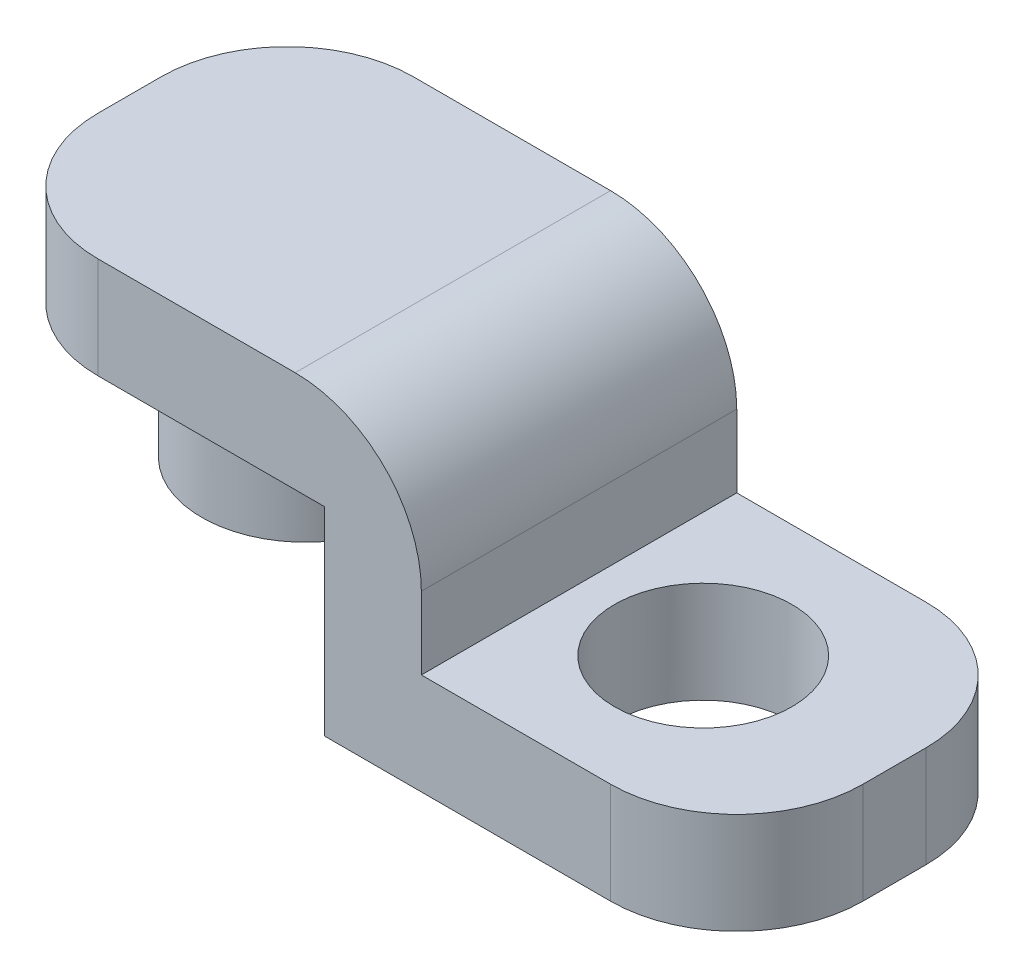
ISO-10303-21;
HEADER;
FILE_DESCRIPTION(('STEP AP214'),'2;1');
FILE_NAME('part.step','',(''),(''),'','','');
FILE_SCHEMA(('AUTOMOTIVE_DESIGN { 1 0 10303 214 1 1 1 1 }'));
ENDSEC;
DATA;
#1=APPLICATION_CONTEXT('core data for automotive mechanical design processes');
#2=APPLICATION_PROTOCOL_DEFINITION('international standard','automotive_design',2000,#1);
#3=PRODUCT_CONTEXT('',#1,'mechanical');
#4=PRODUCT('Part','Part','',(#3));
#5=PRODUCT_RELATED_PRODUCT_CATEGORY('part','',(#4));
#6=PRODUCT_DEFINITION_FORMATION('','',#4);
#7=PRODUCT_DEFINITION_CONTEXT('part definition',#1,'design');
#8=PRODUCT_DEFINITION('design','',#6,#7);
#9=PRODUCT_DEFINITION_SHAPE('','',#8);
#10=(LENGTH_UNIT() NAMED_UNIT(*) SI_UNIT(.MILLI.,.METRE.));
#11=(NAMED_UNIT(*) PLANE_ANGLE_UNIT() SI_UNIT($,.RADIAN.));
#12=(NAMED_UNIT(*) SI_UNIT($,.STERADIAN.) SOLID_ANGLE_UNIT());
#13=UNCERTAINTY_MEASURE_WITH_UNIT(LENGTH_MEASURE(1.E-05),#10,'distance_accuracy_value','');
#14=(GEOMETRIC_REPRESENTATION_CONTEXT(3) GLOBAL_UNCERTAINTY_ASSIGNED_CONTEXT((#13)) GLOBAL_UNIT_ASSIGNED_CONTEXT((#10,
#11,#12)) REPRESENTATION_CONTEXT('',''));
#15=CARTESIAN_POINT('',(0.,0.,0.));
#16=DIRECTION('',(0.,0.,1.));
#17=DIRECTION('',(1.,0.,0.));
#18=AXIS2_PLACEMENT_3D('',#15,#16,#17);
#19=CARTESIAN_POINT('',(3.55,4.,6.35));
#20=DIRECTION('',(0.,1.,0.));
#21=DIRECTION('',(-1.,0.,0.));
#22=AXIS2_PLACEMENT_3D('',#19,#20,#21);
#23=PLANE('',#22);
#24=CARTESIAN_POINT('',(0.,4.,3.175));
#25=DIRECTION('',(0.,1.,0.));
#26=DIRECTION('',(-1.,0.,0.));
#27=AXIS2_PLACEMENT_3D('',#24,#25,#26);
#28=CIRCLE('',#27,2.1);
#29=CARTESIAN_POINT('',(-2.1,4.,3.175));
#30=VERTEX_POINT('',#29);
#31=EDGE_CURVE('E255',#30,#30,#28,.F.);
#32=ORIENTED_EDGE('',*,*,#31,.F.);
#33=EDGE_LOOP('',(#32));
#34=FACE_BOUND('',#33,.T.);
#35=DIRECTION('',(1.,0.,0.));
#36=VECTOR('',#35,1.);
#37=CARTESIAN_POINT('',(3.55,4.,6.35));
#38=LINE('',#37,#36);
#39=CARTESIAN_POINT('',(-1.01,4.,6.35));
#40=VERTEX_POINT('',#39);
#41=CARTESIAN_POINT('',(3.55,4.,6.35));
#42=VERTEX_POINT('',#41);
#43=EDGE_CURVE('E139',#40,#42,#38,.T.);
#44=ORIENTED_EDGE('',*,*,#43,.F.);
#45=CARTESIAN_POINT('',(-1.01,4.,3.81));
#46=DIRECTION('',(0.,1.,0.));
#47=DIRECTION('',(-1.,0.,0.));
#48=AXIS2_PLACEMENT_3D('',#45,#46,#47);
#49=CIRCLE('',#48,2.54);
#50=CARTESIAN_POINT('',(-3.55,4.,3.81));
#51=VERTEX_POINT('',#50);
#52=EDGE_CURVE('E264',#40,#51,#49,.F.);
#53=ORIENTED_EDGE('',*,*,#52,.T.);
#54=DIRECTION('',(0.,0.,-1.));
#55=VECTOR('',#54,1.);
#56=CARTESIAN_POINT('',(-3.55,4.,0.));
#57=LINE('',#56,#55);
#58=CARTESIAN_POINT('',(-3.55,4.,2.54));
#59=VERTEX_POINT('',#58);
#60=EDGE_CURVE('E284',#51,#59,#57,.T.);
#61=ORIENTED_EDGE('',*,*,#60,.T.);
#62=CARTESIAN_POINT('',(-1.01,4.,2.54));
#63=DIRECTION('',(0.,1.,0.));
#64=DIRECTION('',(-1.,0.,0.));
#65=AXIS2_PLACEMENT_3D('',#62,#63,#64);
#66=CIRCLE('',#65,2.54);
#67=CARTESIAN_POINT('',(-1.01,4.,0.));
#68=VERTEX_POINT('',#67);
#69=EDGE_CURVE('E261',#59,#68,#66,.F.);
#70=ORIENTED_EDGE('',*,*,#69,.T.);
#71=DIRECTION('',(1.,0.,0.));
#72=VECTOR('',#71,1.);
#73=CARTESIAN_POINT('',(3.55,4.,0.));
#74=LINE('',#73,#72);
#75=CARTESIAN_POINT('',(3.55,4.,0.));
#76=VERTEX_POINT('',#75);
#77=EDGE_CURVE('E156',#68,#76,#74,.T.);
#78=ORIENTED_EDGE('',*,*,#77,.T.);
#79=DIRECTION('',(0.,0.,-1.));
#80=VECTOR('',#79,1.);
#81=CARTESIAN_POINT('',(3.55,4.,6.35));
#82=LINE('',#81,#80);
#83=EDGE_CURVE('E154',#42,#76,#82,.T.);
#84=ORIENTED_EDGE('',*,*,#83,.F.);
#85=EDGE_LOOP('',(#44,#53,#61,#70,#78,#84));
#86=FACE_BOUND('',#85,.T.);
#87=ADVANCED_FACE('F41',(#34,#86),#23,.F.);
#88=CARTESIAN_POINT('',(3.55,0.,6.35));
#89=DIRECTION('',(1.,0.,0.));
#90=DIRECTION('',(0.,0.,-1.));
#91=AXIS2_PLACEMENT_3D('',#88,#89,#90);
#92=PLANE('',#91);
#93=DIRECTION('',(0.,-1.,0.));
#94=VECTOR('',#93,1.);
#95=CARTESIAN_POINT('',(3.55,0.,0.));
#96=LINE('',#95,#94);
#97=CARTESIAN_POINT('',(3.55,0.,0.));
#98=VERTEX_POINT('',#97);
#99=EDGE_CURVE('E186',#76,#98,#96,.T.);
#100=ORIENTED_EDGE('',*,*,#99,.T.);
#101=DIRECTION('',(0.,0.,-1.));
#102=VECTOR('',#101,1.);
#103=CARTESIAN_POINT('',(3.55,0.,6.35));
#104=LINE('',#103,#102);
#105=CARTESIAN_POINT('',(3.55,0.,6.35));
#106=VERTEX_POINT('',#105);
#107=EDGE_CURVE('E161',#106,#98,#104,.T.);
#108=ORIENTED_EDGE('',*,*,#107,.F.);
#109=DIRECTION('',(0.,-1.,0.));
#110=VECTOR('',#109,1.);
#111=CARTESIAN_POINT('',(3.55,0.,6.35));
#112=LINE('',#111,#110);
#113=EDGE_CURVE('E145',#42,#106,#112,.T.);
#114=ORIENTED_EDGE('',*,*,#113,.F.);
#115=ORIENTED_EDGE('',*,*,#83,.T.);
#116=EDGE_LOOP('',(#100,#108,#114,#115));
#117=FACE_BOUND('',#116,.T.);
#118=ADVANCED_FACE('F163',(#117),#92,.F.);
#119=CARTESIAN_POINT('',(11.85,0.,6.35));
#120=DIRECTION('',(0.,1.,0.));
#121=DIRECTION('',(-1.,0.,0.));
#122=AXIS2_PLACEMENT_3D('',#119,#120,#121);
#123=PLANE('',#122);
#124=CARTESIAN_POINT('',(8.,0.,3.175));
#125=DIRECTION('',(0.,1.,0.));
#126=DIRECTION('',(-1.,0.,0.));
#127=AXIS2_PLACEMENT_3D('',#124,#125,#126);
#128=CIRCLE('',#127,1.7859375);
#129=CARTESIAN_POINT('',(6.2140625,0.,3.175));
#130=VERTEX_POINT('',#129);
#131=EDGE_CURVE('E187',#130,#130,#128,.F.);
#132=ORIENTED_EDGE('',*,*,#131,.F.);
#133=EDGE_LOOP('',(#132));
#134=FACE_BOUND('',#133,.T.);
#135=DIRECTION('',(1.,0.,0.));
#136=VECTOR('',#135,1.);
#137=CARTESIAN_POINT('',(11.85,0.,0.));
#138=LINE('',#137,#136);
#139=CARTESIAN_POINT('',(9.31,0.,0.));
#140=VERTEX_POINT('',#139);
#141=EDGE_CURVE('E190',#98,#140,#138,.T.);
#142=ORIENTED_EDGE('',*,*,#141,.T.);
#143=CARTESIAN_POINT('',(9.31,0.,2.54));
#144=DIRECTION('',(0.,1.,0.));
#145=DIRECTION('',(-1.,0.,0.));
#146=AXIS2_PLACEMENT_3D('',#143,#144,#145);
#147=CIRCLE('',#146,2.54);
#148=CARTESIAN_POINT('',(11.85,0.,2.54));
#149=VERTEX_POINT('',#148);
#150=EDGE_CURVE('E238',#140,#149,#147,.F.);
#151=ORIENTED_EDGE('',*,*,#150,.T.);
#152=DIRECTION('',(0.,0.,-1.));
#153=VECTOR('',#152,1.);
#154=CARTESIAN_POINT('',(11.85,0.,6.35));
#155=LINE('',#154,#153);
#156=CARTESIAN_POINT('',(11.85,0.,3.81));
#157=VERTEX_POINT('',#156);
#158=EDGE_CURVE('E211',#157,#149,#155,.T.);
#159=ORIENTED_EDGE('',*,*,#158,.F.);
#160=CARTESIAN_POINT('',(9.31,0.,3.81));
#161=DIRECTION('',(0.,1.,0.));
#162=DIRECTION('',(-1.,0.,0.));
#163=AXIS2_PLACEMENT_3D('',#160,#161,#162);
#164=CIRCLE('',#163,2.54);
#165=CARTESIAN_POINT('',(9.31,0.,6.35));
#166=VERTEX_POINT('',#165);
#167=EDGE_CURVE('E235',#157,#166,#164,.F.);
#168=ORIENTED_EDGE('',*,*,#167,.T.);
#169=DIRECTION('',(1.,0.,0.));
#170=VECTOR('',#169,1.);
#171=CARTESIAN_POINT('',(11.85,0.,6.35));
#172=LINE('',#171,#170);
#173=EDGE_CURVE('E167',#106,#166,#172,.T.);
#174=ORIENTED_EDGE('',*,*,#173,.F.);
#175=ORIENTED_EDGE('',*,*,#107,.T.);
#176=EDGE_LOOP('',(#142,#151,#159,#168,#174,#175));
#177=FACE_BOUND('',#176,.T.);
#178=ADVANCED_FACE('F305',(#134,#177),#123,.F.);
#179=CARTESIAN_POINT('',(11.85,2.04,6.35));
#180=DIRECTION('',(-1.,0.,0.));
#181=DIRECTION('',(0.,0.,1.));
#182=AXIS2_PLACEMENT_3D('',#179,#180,#181);
#183=PLANE('',#182);
#184=ORIENTED_EDGE('',*,*,#158,.T.);
#185=DIRECTION('',(0.,1.,0.));
#186=VECTOR('',#185,1.);
#187=CARTESIAN_POINT('',(11.85,2.04,2.54));
#188=LINE('',#187,#186);
#189=CARTESIAN_POINT('',(11.85,2.04,2.54));
#190=VERTEX_POINT('',#189);
#191=EDGE_CURVE('E219',#149,#190,#188,.T.);
#192=ORIENTED_EDGE('',*,*,#191,.T.);
#193=DIRECTION('',(0.,0.,-1.));
#194=VECTOR('',#193,1.);
#195=CARTESIAN_POINT('',(11.85,2.04,6.35));
#196=LINE('',#195,#194);
#197=CARTESIAN_POINT('',(11.85,2.04,3.81));
#198=VERTEX_POINT('',#197);
#199=EDGE_CURVE('E207',#198,#190,#196,.T.);
#200=ORIENTED_EDGE('',*,*,#199,.F.);
#201=DIRECTION('',(0.,1.,0.));
#202=VECTOR('',#201,1.);
#203=CARTESIAN_POINT('',(11.85,2.04,3.81));
#204=LINE('',#203,#202);
#205=EDGE_CURVE('E160',#198,#157,#204,.F.);
#206=ORIENTED_EDGE('',*,*,#205,.T.);
#207=EDGE_LOOP('',(#184,#192,#200,#206));
#208=FACE_BOUND('',#207,.T.);
#209=ADVANCED_FACE('F308',(#208),#183,.F.);
#210=CARTESIAN_POINT('',(5.5,2.04,6.35));
#211=DIRECTION('',(0.,-1.,0.));
#212=DIRECTION('',(0.,0.,-1.));
#213=AXIS2_PLACEMENT_3D('',#210,#211,#212);
#214=PLANE('',#213);
#215=CARTESIAN_POINT('',(8.,2.04,3.175));
#216=DIRECTION('',(0.,1.,0.));
#217=DIRECTION('',(0.,0.,1.));
#218=AXIS2_PLACEMENT_3D('',#215,#216,#217);
#219=CIRCLE('',#218,1.7859375);
#220=CARTESIAN_POINT('',(8.,2.04,4.9609375));
#221=VERTEX_POINT('',#220);
#222=EDGE_CURVE('E292',#221,#221,#219,.T.);
#223=ORIENTED_EDGE('',*,*,#222,.F.);
#224=EDGE_LOOP('',(#223));
#225=FACE_BOUND('',#224,.T.);
#226=ORIENTED_EDGE('',*,*,#199,.T.);
#227=CARTESIAN_POINT('',(9.31,2.04,2.54));
#228=DIRECTION('',(0.,-1.,0.));
#229=DIRECTION('',(0.,0.,-1.));
#230=AXIS2_PLACEMENT_3D('',#227,#228,#229);
#231=CIRCLE('',#230,2.54);
#232=CARTESIAN_POINT('',(9.31,2.04,0.));
#233=VERTEX_POINT('',#232);
#234=EDGE_CURVE('E226',#190,#233,#231,.F.);
#235=ORIENTED_EDGE('',*,*,#234,.T.);
#236=DIRECTION('',(-1.,0.,0.));
#237=VECTOR('',#236,1.);
#238=CARTESIAN_POINT('',(5.5,2.04,0.));
#239=LINE('',#238,#237);
#240=CARTESIAN_POINT('',(5.5,2.04,0.));
#241=VERTEX_POINT('',#240);
#242=EDGE_CURVE('E194',#233,#241,#239,.T.);
#243=ORIENTED_EDGE('',*,*,#242,.T.);
#244=DIRECTION('',(0.,0.,-1.));
#245=VECTOR('',#244,1.);
#246=CARTESIAN_POINT('',(5.5,2.04,6.35));
#247=LINE('',#246,#245);
#248=CARTESIAN_POINT('',(5.5,2.04,6.35));
#249=VERTEX_POINT('',#248);
#250=EDGE_CURVE('E183',#249,#241,#247,.T.);
#251=ORIENTED_EDGE('',*,*,#250,.F.);
#252=DIRECTION('',(-1.,0.,0.));
#253=VECTOR('',#252,1.);
#254=CARTESIAN_POINT('',(5.5,2.04,6.35));
#255=LINE('',#254,#253);
#256=CARTESIAN_POINT('',(9.31,2.04,6.35));
#257=VERTEX_POINT('',#256);
#258=EDGE_CURVE('E170',#257,#249,#255,.T.);
#259=ORIENTED_EDGE('',*,*,#258,.F.);
#260=CARTESIAN_POINT('',(9.31,2.04,3.81));
#261=DIRECTION('',(0.,-1.,0.));
#262=DIRECTION('',(0.,0.,-1.));
#263=AXIS2_PLACEMENT_3D('',#260,#261,#262);
#264=CIRCLE('',#263,2.54);
#265=EDGE_CURVE('E223',#257,#198,#264,.F.);
#266=ORIENTED_EDGE('',*,*,#265,.T.);
#267=EDGE_LOOP('',(#226,#235,#243,#251,#259,#266));
#268=FACE_BOUND('',#267,.T.);
#269=ADVANCED_FACE('F322',(#225,#268),#214,.F.);
#270=CARTESIAN_POINT('',(5.5,6.04,6.35));
#271=DIRECTION('',(-1.,0.,0.));
#272=DIRECTION('',(0.,-1.,0.));
#273=AXIS2_PLACEMENT_3D('',#270,#271,#272);
#274=PLANE('',#273);
#275=DIRECTION('',(0.,1.,0.));
#276=VECTOR('',#275,1.);
#277=CARTESIAN_POINT('',(5.5,6.04,0.));
#278=LINE('',#277,#276);
#279=CARTESIAN_POINT('',(5.5,3.5,0.));
#280=VERTEX_POINT('',#279);
#281=EDGE_CURVE('E197',#241,#280,#278,.T.);
#282=ORIENTED_EDGE('',*,*,#281,.T.);
#283=DIRECTION('',(0.,0.,-1.));
#284=VECTOR('',#283,1.);
#285=CARTESIAN_POINT('',(5.5,3.5,6.35));
#286=LINE('',#285,#284);
#287=CARTESIAN_POINT('',(5.5,3.5,6.35));
#288=VERTEX_POINT('',#287);
#289=EDGE_CURVE('E252',#280,#288,#286,.F.);
#290=ORIENTED_EDGE('',*,*,#289,.T.);
#291=DIRECTION('',(0.,1.,0.));
#292=VECTOR('',#291,1.);
#293=CARTESIAN_POINT('',(5.5,6.04,6.35));
#294=LINE('',#293,#292);
#295=EDGE_CURVE('E176',#249,#288,#294,.T.);
#296=ORIENTED_EDGE('',*,*,#295,.F.);
#297=ORIENTED_EDGE('',*,*,#250,.T.);
#298=EDGE_LOOP('',(#282,#290,#296,#297));
#299=FACE_BOUND('',#298,.T.);
#300=ADVANCED_FACE('F333',(#299),#274,.F.);
#301=CARTESIAN_POINT('',(0.,6.04,6.35));
#302=DIRECTION('',(0.,-1.,0.));
#303=DIRECTION('',(0.,0.,-1.));
#304=AXIS2_PLACEMENT_3D('',#301,#302,#303);
#305=PLANE('',#304);
#306=DIRECTION('',(0.,0.,1.));
#307=VECTOR('',#306,1.);
#308=CARTESIAN_POINT('',(-3.55,6.04,6.35));
#309=LINE('',#308,#307);
#310=CARTESIAN_POINT('',(-3.55,6.04,2.54));
#311=VERTEX_POINT('',#310);
#312=CARTESIAN_POINT('',(-3.55,6.04,3.81));
#313=VERTEX_POINT('',#312);
#314=EDGE_CURVE('E279',#311,#313,#309,.T.);
#315=ORIENTED_EDGE('',*,*,#314,.T.);
#316=CARTESIAN_POINT('',(-1.01,6.04,3.81));
#317=DIRECTION('',(0.,-1.,0.));
#318=DIRECTION('',(0.,0.,-1.));
#319=AXIS2_PLACEMENT_3D('',#316,#317,#318);
#320=CIRCLE('',#319,2.54);
#321=CARTESIAN_POINT('',(-1.01,6.04,6.35));
#322=VERTEX_POINT('',#321);
#323=EDGE_CURVE('E50',#313,#322,#320,.F.);
#324=ORIENTED_EDGE('',*,*,#323,.T.);
#325=DIRECTION('',(-1.,0.,0.));
#326=VECTOR('',#325,1.);
#327=CARTESIAN_POINT('',(0.,6.04,6.35));
#328=LINE('',#327,#326);
#329=CARTESIAN_POINT('',(2.96,6.04,6.35));
#330=VERTEX_POINT('',#329);
#331=EDGE_CURVE('E180',#330,#322,#328,.T.);
#332=ORIENTED_EDGE('',*,*,#331,.F.);
#333=DIRECTION('',(0.,0.,-1.));
#334=VECTOR('',#333,1.);
#335=CARTESIAN_POINT('',(2.96,6.04,6.35));
#336=LINE('',#335,#334);
#337=CARTESIAN_POINT('',(2.96,6.04,0.));
#338=VERTEX_POINT('',#337);
#339=EDGE_CURVE('E248',#330,#338,#336,.T.);
#340=ORIENTED_EDGE('',*,*,#339,.T.);
#341=DIRECTION('',(-1.,0.,0.));
#342=VECTOR('',#341,1.);
#343=CARTESIAN_POINT('',(0.,6.04,0.));
#344=LINE('',#343,#342);
#345=CARTESIAN_POINT('',(-1.01,6.04,0.));
#346=VERTEX_POINT('',#345);
#347=EDGE_CURVE('E151',#338,#346,#344,.T.);
#348=ORIENTED_EDGE('',*,*,#347,.T.);
#349=CARTESIAN_POINT('',(-1.01,6.04,2.54));
#350=DIRECTION('',(0.,-1.,0.));
#351=DIRECTION('',(0.,0.,-1.));
#352=AXIS2_PLACEMENT_3D('',#349,#350,#351);
#353=CIRCLE('',#352,2.54);
#354=EDGE_CURVE('E57',#346,#311,#353,.F.);
#355=ORIENTED_EDGE('',*,*,#354,.T.);
#356=EDGE_LOOP('',(#315,#324,#332,#340,#348,#355));
#357=FACE_BOUND('',#356,.T.);
#358=ADVANCED_FACE('F277',(#357),#305,.F.);
#359=CARTESIAN_POINT('',(0.,0.,6.35));
#360=DIRECTION('',(0.,0.,-1.));
#361=DIRECTION('',(-1.,0.,0.));
#362=AXIS2_PLACEMENT_3D('',#359,#360,#361);
#363=PLANE('',#362);
#364=ORIENTED_EDGE('',*,*,#331,.T.);
#365=DIRECTION('',(0.,-1.,0.));
#366=VECTOR('',#365,1.);
#367=CARTESIAN_POINT('',(-1.01,0.,6.35));
#368=LINE('',#367,#366);
#369=EDGE_CURVE('E148',#322,#40,#368,.T.);
#370=ORIENTED_EDGE('',*,*,#369,.T.);
#371=ORIENTED_EDGE('',*,*,#43,.T.);
#372=ORIENTED_EDGE('',*,*,#113,.T.);
#373=ORIENTED_EDGE('',*,*,#173,.T.);
#374=DIRECTION('',(0.,1.,0.));
#375=VECTOR('',#374,1.);
#376=CARTESIAN_POINT('',(9.31,0.,6.35));
#377=LINE('',#376,#375);
#378=EDGE_CURVE('E244',#166,#257,#377,.T.);
#379=ORIENTED_EDGE('',*,*,#378,.T.);
#380=ORIENTED_EDGE('',*,*,#258,.T.);
#381=ORIENTED_EDGE('',*,*,#295,.T.);
#382=CARTESIAN_POINT('',(2.96,3.5,6.35));
#383=DIRECTION('',(0.,0.,-1.));
#384=DIRECTION('',(-1.,0.,0.));
#385=AXIS2_PLACEMENT_3D('',#382,#383,#384);
#386=CIRCLE('',#385,2.54);
#387=EDGE_CURVE('E241',#288,#330,#386,.F.);
#388=ORIENTED_EDGE('',*,*,#387,.T.);
#389=EDGE_LOOP('',(#364,#370,#371,#372,#373,#379,#380,#381,#388));
#390=FACE_BOUND('',#389,.T.);
#391=ADVANCED_FACE('F142',(#390),#363,.F.);
#392=CARTESIAN_POINT('',(0.,0.,0.));
#393=DIRECTION('',(0.,0.,-1.));
#394=DIRECTION('',(-1.,0.,0.));
#395=AXIS2_PLACEMENT_3D('',#392,#393,#394);
#396=PLANE('',#395);
#397=ORIENTED_EDGE('',*,*,#77,.F.);
#398=DIRECTION('',(0.,1.,0.));
#399=VECTOR('',#398,1.);
#400=CARTESIAN_POINT('',(-1.01,6.04,0.));
#401=LINE('',#400,#399);
#402=EDGE_CURVE('E12',#68,#346,#401,.T.);
#403=ORIENTED_EDGE('',*,*,#402,.T.);
#404=ORIENTED_EDGE('',*,*,#347,.F.);
#405=CARTESIAN_POINT('',(2.96,3.5,0.));
#406=DIRECTION('',(0.,0.,-1.));
#407=DIRECTION('',(-1.,0.,0.));
#408=AXIS2_PLACEMENT_3D('',#405,#406,#407);
#409=CIRCLE('',#408,2.54);
#410=EDGE_CURVE('E229',#338,#280,#409,.T.);
#411=ORIENTED_EDGE('',*,*,#410,.T.);
#412=ORIENTED_EDGE('',*,*,#281,.F.);
#413=ORIENTED_EDGE('',*,*,#242,.F.);
#414=DIRECTION('',(0.,1.,0.));
#415=VECTOR('',#414,1.);
#416=CARTESIAN_POINT('',(9.31,0.,0.));
#417=LINE('',#416,#415);
#418=EDGE_CURVE('E232',#233,#140,#417,.F.);
#419=ORIENTED_EDGE('',*,*,#418,.T.);
#420=ORIENTED_EDGE('',*,*,#141,.F.);
#421=ORIENTED_EDGE('',*,*,#99,.F.);
#422=EDGE_LOOP('',(#397,#403,#404,#411,#412,#413,#419,#420,#421));
#423=FACE_BOUND('',#422,.T.);
#424=ADVANCED_FACE('F338',(#423),#396,.T.);
#425=CARTESIAN_POINT('',(9.31,2.04,2.54));
#426=DIRECTION('',(0.,-1.,0.));
#427=DIRECTION('',(0.,0.,-1.));
#428=AXIS2_PLACEMENT_3D('',#425,#426,#427);
#429=CYLINDRICAL_SURFACE('',#428,2.54);
#430=ORIENTED_EDGE('',*,*,#150,.F.);
#431=ORIENTED_EDGE('',*,*,#418,.F.);
#432=ORIENTED_EDGE('',*,*,#234,.F.);
#433=ORIENTED_EDGE('',*,*,#191,.F.);
#434=EDGE_LOOP('',(#430,#431,#432,#433));
#435=FACE_BOUND('',#434,.T.);
#436=ADVANCED_FACE('F317',(#435),#429,.T.);
#437=CARTESIAN_POINT('',(9.31,0.,3.81));
#438=DIRECTION('',(0.,1.,0.));
#439=DIRECTION('',(0.,0.,1.));
#440=AXIS2_PLACEMENT_3D('',#437,#438,#439);
#441=CYLINDRICAL_SURFACE('',#440,2.54);
#442=ORIENTED_EDGE('',*,*,#167,.F.);
#443=ORIENTED_EDGE('',*,*,#205,.F.);
#444=ORIENTED_EDGE('',*,*,#265,.F.);
#445=ORIENTED_EDGE('',*,*,#378,.F.);
#446=EDGE_LOOP('',(#442,#443,#444,#445));
#447=FACE_BOUND('',#446,.T.);
#448=ADVANCED_FACE('F329',(#447),#441,.T.);
#449=CARTESIAN_POINT('',(2.96,3.5,6.35));
#450=DIRECTION('',(0.,0.,-1.));
#451=DIRECTION('',(-1.,0.,0.));
#452=AXIS2_PLACEMENT_3D('',#449,#450,#451);
#453=CYLINDRICAL_SURFACE('',#452,2.54);
#454=ORIENTED_EDGE('',*,*,#387,.F.);
#455=ORIENTED_EDGE('',*,*,#289,.F.);
#456=ORIENTED_EDGE('',*,*,#410,.F.);
#457=ORIENTED_EDGE('',*,*,#339,.F.);
#458=EDGE_LOOP('',(#454,#455,#456,#457));
#459=FACE_BOUND('',#458,.T.);
#460=ADVANCED_FACE('F336',(#459),#453,.T.);
#461=CARTESIAN_POINT('',(8.,-0.00100000000000013,3.175));
#462=DIRECTION('',(0.,1.,0.));
#463=DIRECTION('',(0.,0.,1.));
#464=AXIS2_PLACEMENT_3D('',#461,#462,#463);
#465=CYLINDRICAL_SURFACE('',#464,1.7859375);
#466=ORIENTED_EDGE('',*,*,#222,.T.);
#467=EDGE_LOOP('',(#466));
#468=FACE_BOUND('',#467,.T.);
#469=ORIENTED_EDGE('',*,*,#131,.T.);
#470=EDGE_LOOP('',(#469));
#471=FACE_BOUND('',#470,.T.);
#472=ADVANCED_FACE('F303',(#468,#471),#465,.F.);
#473=CARTESIAN_POINT('',(-3.55,0.,6.35));
#474=DIRECTION('',(1.,0.,0.));
#475=DIRECTION('',(0.,0.,-1.));
#476=AXIS2_PLACEMENT_3D('',#473,#474,#475);
#477=PLANE('',#476);
#478=ORIENTED_EDGE('',*,*,#60,.F.);
#479=DIRECTION('',(0.,-1.,0.));
#480=VECTOR('',#479,1.);
#481=CARTESIAN_POINT('',(-3.55,0.,3.81));
#482=LINE('',#481,#480);
#483=EDGE_CURVE('E64',#51,#313,#482,.F.);
#484=ORIENTED_EDGE('',*,*,#483,.T.);
#485=ORIENTED_EDGE('',*,*,#314,.F.);
#486=DIRECTION('',(0.,1.,0.));
#487=VECTOR('',#486,1.);
#488=CARTESIAN_POINT('',(-3.55,4.,2.54));
#489=LINE('',#488,#487);
#490=EDGE_CURVE('E267',#311,#59,#489,.F.);
#491=ORIENTED_EDGE('',*,*,#490,.T.);
#492=EDGE_LOOP('',(#478,#484,#485,#491));
#493=FACE_BOUND('',#492,.T.);
#494=ADVANCED_FACE('F286',(#493),#477,.F.);
#495=CARTESIAN_POINT('',(0.,1.5,3.175));
#496=DIRECTION('',(0.,1.,0.));
#497=DIRECTION('',(0.,0.,1.));
#498=AXIS2_PLACEMENT_3D('',#495,#496,#497);
#499=CYLINDRICAL_SURFACE('',#498,2.1);
#500=CARTESIAN_POINT('',(0.,1.5,3.175));
#501=DIRECTION('',(0.,-1.,0.));
#502=DIRECTION('',(0.,0.,-1.));
#503=AXIS2_PLACEMENT_3D('',#500,#501,#502);
#504=CIRCLE('',#503,2.1);
#505=CARTESIAN_POINT('',(0.,1.5,1.075));
#506=VERTEX_POINT('',#505);
#507=EDGE_CURVE('E288',#506,#506,#504,.T.);
#508=ORIENTED_EDGE('',*,*,#507,.F.);
#509=EDGE_LOOP('',(#508));
#510=FACE_BOUND('',#509,.T.);
#511=ORIENTED_EDGE('',*,*,#31,.T.);
#512=EDGE_LOOP('',(#511));
#513=FACE_BOUND('',#512,.T.);
#514=ADVANCED_FACE('F366',(#510,#513),#499,.T.);
#515=CARTESIAN_POINT('',(0.,1.5,3.175));
#516=DIRECTION('',(0.,-1.,0.));
#517=DIRECTION('',(0.,0.,-1.));
#518=AXIS2_PLACEMENT_3D('',#515,#516,#517);
#519=PLANE('',#518);
#520=ORIENTED_EDGE('',*,*,#507,.T.);
#521=EDGE_LOOP('',(#520));
#522=FACE_BOUND('',#521,.T.);
#523=ADVANCED_FACE('F343',(#522),#519,.T.);
#524=CARTESIAN_POINT('',(-1.01,0.,3.81));
#525=DIRECTION('',(0.,-1.,0.));
#526=DIRECTION('',(0.,0.,-1.));
#527=AXIS2_PLACEMENT_3D('',#524,#525,#526);
#528=CYLINDRICAL_SURFACE('',#527,2.54);
#529=ORIENTED_EDGE('',*,*,#323,.F.);
#530=ORIENTED_EDGE('',*,*,#483,.F.);
#531=ORIENTED_EDGE('',*,*,#52,.F.);
#532=ORIENTED_EDGE('',*,*,#369,.F.);
#533=EDGE_LOOP('',(#529,#530,#531,#532));
#534=FACE_BOUND('',#533,.T.);
#535=ADVANCED_FACE('F282',(#534),#528,.T.);
#536=CARTESIAN_POINT('',(-1.01,0.,2.54));
#537=DIRECTION('',(0.,-1.,0.));
#538=DIRECTION('',(0.,0.,-1.));
#539=AXIS2_PLACEMENT_3D('',#536,#537,#538);
#540=CYLINDRICAL_SURFACE('',#539,2.54);
#541=ORIENTED_EDGE('',*,*,#69,.F.);
#542=ORIENTED_EDGE('',*,*,#490,.F.);
#543=ORIENTED_EDGE('',*,*,#354,.F.);
#544=ORIENTED_EDGE('',*,*,#402,.F.);
#545=EDGE_LOOP('',(#541,#542,#543,#544));
#546=FACE_BOUND('',#545,.T.);
#547=ADVANCED_FACE('F43',(#546),#540,.T.);
#548=CLOSED_SHELL('',(#87,#118,#178,#209,#269,#300,#358,#391,#424,#436,#448,#460,#472,#494,#514,
#523,#535,#547));
#549=MANIFOLD_SOLID_BREP('B2',#548);
#550=ADVANCED_BREP_SHAPE_REPRESENTATION('',(#18,#549),#14);
#551=SHAPE_DEFINITION_REPRESENTATION(#9,#550);
ENDSEC;
END-ISO-10303-21;
